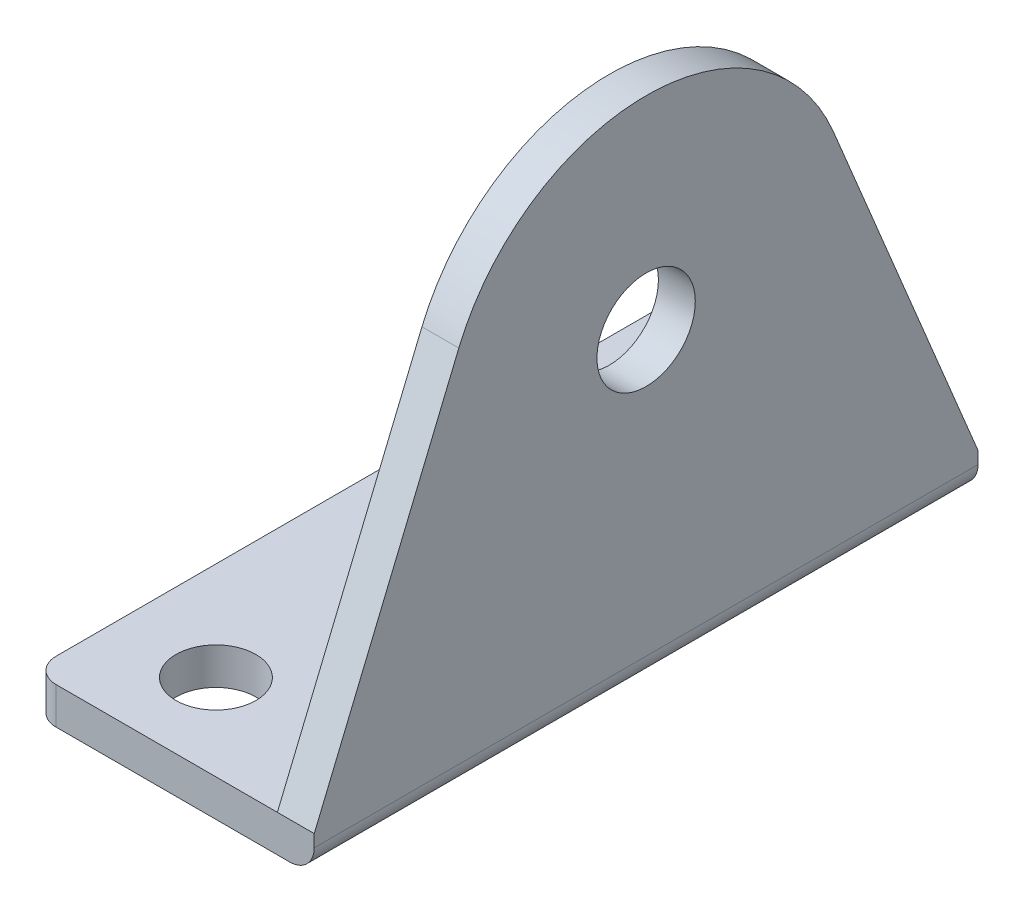
ISO-10303-21;
HEADER;
FILE_DESCRIPTION(('STEP AP214'),'2;1');
FILE_NAME('part.step','',(''),(''),'','','');
FILE_SCHEMA(('AUTOMOTIVE_DESIGN { 1 0 10303 214 1 1 1 1 }'));
ENDSEC;
DATA;
#1=APPLICATION_CONTEXT('core data for automotive mechanical design processes');
#2=APPLICATION_PROTOCOL_DEFINITION('international standard','automotive_design',2000,#1);
#3=PRODUCT_CONTEXT('',#1,'mechanical');
#4=PRODUCT('Part','Part','',(#3));
#5=PRODUCT_RELATED_PRODUCT_CATEGORY('part','',(#4));
#6=PRODUCT_DEFINITION_FORMATION('','',#4);
#7=PRODUCT_DEFINITION_CONTEXT('part definition',#1,'design');
#8=PRODUCT_DEFINITION('design','',#6,#7);
#9=PRODUCT_DEFINITION_SHAPE('','',#8);
#10=(LENGTH_UNIT() NAMED_UNIT(*) SI_UNIT(.MILLI.,.METRE.));
#11=(NAMED_UNIT(*) PLANE_ANGLE_UNIT() SI_UNIT($,.RADIAN.));
#12=(NAMED_UNIT(*) SI_UNIT($,.STERADIAN.) SOLID_ANGLE_UNIT());
#13=UNCERTAINTY_MEASURE_WITH_UNIT(LENGTH_MEASURE(1.E-05),#10,'distance_accuracy_value','');
#14=(GEOMETRIC_REPRESENTATION_CONTEXT(3) GLOBAL_UNCERTAINTY_ASSIGNED_CONTEXT((#13)) GLOBAL_UNIT_ASSIGNED_CONTEXT((#10,
#11,#12)) REPRESENTATION_CONTEXT('',''));
#15=CARTESIAN_POINT('',(0.,0.,0.));
#16=DIRECTION('',(0.,0.,1.));
#17=DIRECTION('',(1.,0.,0.));
#18=AXIS2_PLACEMENT_3D('',#15,#16,#17);
#19=CARTESIAN_POINT('',(-11.,-22.,0.));
#20=DIRECTION('',(-1.,0.,0.));
#21=DIRECTION('',(0.,0.,-1.));
#22=AXIS2_PLACEMENT_3D('',#19,#20,#21);
#23=PLANE('',#22);
#24=DIRECTION('',(0.,0.,1.));
#25=VECTOR('',#24,1.);
#26=CARTESIAN_POINT('',(-11.,-25.,25.));
#27=LINE('',#26,#25);
#28=CARTESIAN_POINT('',(-11.,-25.,-25.));
#29=VERTEX_POINT('',#28);
#30=CARTESIAN_POINT('',(-11.,-25.,25.));
#31=VERTEX_POINT('',#30);
#32=EDGE_CURVE('E140',#29,#31,#27,.T.);
#33=ORIENTED_EDGE('',*,*,#32,.T.);
#34=DIRECTION('',(0.,-1.,0.));
#35=VECTOR('',#34,1.);
#36=CARTESIAN_POINT('',(-11.,-22.,25.));
#37=LINE('',#36,#35);
#38=CARTESIAN_POINT('',(-11.,-22.,25.));
#39=VERTEX_POINT('',#38);
#40=EDGE_CURVE('E184',#39,#31,#37,.T.);
#41=ORIENTED_EDGE('',*,*,#40,.F.);
#42=DIRECTION('',(0.,0.,-1.));
#43=VECTOR('',#42,1.);
#44=CARTESIAN_POINT('',(-11.,-22.,25.));
#45=LINE('',#44,#43);
#46=CARTESIAN_POINT('',(-11.,-22.,-25.));
#47=VERTEX_POINT('',#46);
#48=EDGE_CURVE('E143',#39,#47,#45,.T.);
#49=ORIENTED_EDGE('',*,*,#48,.T.);
#50=DIRECTION('',(0.,-1.,0.));
#51=VECTOR('',#50,1.);
#52=CARTESIAN_POINT('',(-11.,-22.,-25.));
#53=LINE('',#52,#51);
#54=EDGE_CURVE('E12',#47,#29,#53,.T.);
#55=ORIENTED_EDGE('',*,*,#54,.T.);
#56=EDGE_LOOP('',(#33,#41,#49,#55));
#57=FACE_BOUND('',#56,.T.);
#58=ADVANCED_FACE('F52',(#57),#23,.T.);
#59=CARTESIAN_POINT('',(-9.,-22.,-25.));
#60=DIRECTION('',(0.,1.,0.));
#61=DIRECTION('',(0.,0.,-1.));
#62=AXIS2_PLACEMENT_3D('',#59,#60,#61);
#63=CYLINDRICAL_SURFACE('',#62,2.);
#64=CARTESIAN_POINT('',(-9.,-25.,-25.));
#65=DIRECTION('',(0.,1.,0.));
#66=DIRECTION('',(0.,0.,-1.));
#67=AXIS2_PLACEMENT_3D('',#64,#65,#66);
#68=CIRCLE('',#67,2.);
#69=CARTESIAN_POINT('',(-9.,-25.,-27.));
#70=VERTEX_POINT('',#69);
#71=EDGE_CURVE('E92',#70,#29,#68,.T.);
#72=ORIENTED_EDGE('',*,*,#71,.T.);
#73=ORIENTED_EDGE('',*,*,#54,.F.);
#74=CARTESIAN_POINT('',(-9.,-22.,-25.));
#75=DIRECTION('',(0.,-1.,0.));
#76=DIRECTION('',(0.,0.,-1.));
#77=AXIS2_PLACEMENT_3D('',#74,#75,#76);
#78=CIRCLE('',#77,2.);
#79=CARTESIAN_POINT('',(-9.,-22.,-27.));
#80=VERTEX_POINT('',#79);
#81=EDGE_CURVE('E206',#47,#80,#78,.T.);
#82=ORIENTED_EDGE('',*,*,#81,.T.);
#83=DIRECTION('',(0.,-1.,0.));
#84=VECTOR('',#83,1.);
#85=CARTESIAN_POINT('',(-9.,-22.,-27.));
#86=LINE('',#85,#84);
#87=EDGE_CURVE('E148',#80,#70,#86,.T.);
#88=ORIENTED_EDGE('',*,*,#87,.T.);
#89=EDGE_LOOP('',(#72,#73,#82,#88));
#90=FACE_BOUND('',#89,.T.);
#91=ADVANCED_FACE('F146',(#90),#63,.T.);
#92=CARTESIAN_POINT('',(12.,-22.,0.));
#93=DIRECTION('',(1.,0.,0.));
#94=DIRECTION('',(0.,0.,1.));
#95=AXIS2_PLACEMENT_3D('',#92,#93,#94);
#96=PLANE('',#95);
#97=CARTESIAN_POINT('',(12.,0.,0.));
#98=DIRECTION('',(1.,0.,0.));
#99=DIRECTION('',(0.,0.,-1.));
#100=AXIS2_PLACEMENT_3D('',#97,#98,#99);
#101=CIRCLE('',#100,4.);
#102=CARTESIAN_POINT('',(12.,0.,-4.));
#103=VERTEX_POINT('',#102);
#104=EDGE_CURVE('E316',#103,#103,#101,.T.);
#105=ORIENTED_EDGE('',*,*,#104,.F.);
#106=EDGE_LOOP('',(#105));
#107=FACE_BOUND('',#106,.T.);
#108=DIRECTION('',(0.,0.,-1.));
#109=VECTOR('',#108,1.);
#110=CARTESIAN_POINT('',(12.,-23.,0.));
#111=LINE('',#110,#109);
#112=CARTESIAN_POINT('',(12.,-23.,27.));
#113=VERTEX_POINT('',#112);
#114=CARTESIAN_POINT('',(12.,-23.,-27.));
#115=VERTEX_POINT('',#114);
#116=EDGE_CURVE('E186',#113,#115,#111,.T.);
#117=ORIENTED_EDGE('',*,*,#116,.T.);
#118=DIRECTION('',(0.,-1.,0.));
#119=VECTOR('',#118,1.);
#120=CARTESIAN_POINT('',(12.,-22.,-27.));
#121=LINE('',#120,#119);
#122=CARTESIAN_POINT('',(12.,-22.,-27.));
#123=VERTEX_POINT('',#122);
#124=EDGE_CURVE('E199',#123,#115,#121,.T.);
#125=ORIENTED_EDGE('',*,*,#124,.F.);
#126=DIRECTION('',(0.,-0.923558334060066,-0.383457955437354));
#127=VECTOR('',#126,1.);
#128=CARTESIAN_POINT('',(12.,-22.,-27.));
#129=LINE('',#128,#127);
#130=CARTESIAN_POINT('',(12.,6.32705626471634,-15.2387125119911));
#131=VERTEX_POINT('',#130);
#132=EDGE_CURVE('E118',#131,#123,#129,.T.);
#133=ORIENTED_EDGE('',*,*,#132,.F.);
#134=CARTESIAN_POINT('',(12.,0.,0.));
#135=DIRECTION('',(-1.,0.,0.));
#136=DIRECTION('',(0.,0.,-1.));
#137=AXIS2_PLACEMENT_3D('',#134,#135,#136);
#138=CIRCLE('',#137,16.5);
#139=CARTESIAN_POINT('',(12.,6.32705626471634,15.2387125119911));
#140=VERTEX_POINT('',#139);
#141=EDGE_CURVE('E165',#140,#131,#138,.T.);
#142=ORIENTED_EDGE('',*,*,#141,.F.);
#143=DIRECTION('',(0.,0.923558334060066,-0.383457955437354));
#144=VECTOR('',#143,1.);
#145=CARTESIAN_POINT('',(12.,-22.,27.));
#146=LINE('',#145,#144);
#147=CARTESIAN_POINT('',(12.,-22.,27.));
#148=VERTEX_POINT('',#147);
#149=EDGE_CURVE('E151',#148,#140,#146,.T.);
#150=ORIENTED_EDGE('',*,*,#149,.F.);
#151=DIRECTION('',(0.,-1.,0.));
#152=VECTOR('',#151,1.);
#153=CARTESIAN_POINT('',(12.,-22.,27.));
#154=LINE('',#153,#152);
#155=EDGE_CURVE('E63',#148,#113,#154,.T.);
#156=ORIENTED_EDGE('',*,*,#155,.T.);
#157=EDGE_LOOP('',(#117,#125,#133,#142,#150,#156));
#158=FACE_BOUND('',#157,.T.);
#159=ADVANCED_FACE('F485',(#107,#158),#96,.T.);
#160=CARTESIAN_POINT('',(1.5,-22.,27.));
#161=DIRECTION('',(0.,0.,1.));
#162=DIRECTION('',(-1.,0.,0.));
#163=AXIS2_PLACEMENT_3D('',#160,#161,#162);
#164=PLANE('',#163);
#165=CARTESIAN_POINT('',(10.,-23.,27.));
#166=DIRECTION('',(0.,0.,1.));
#167=DIRECTION('',(0.,-1.,0.));
#168=AXIS2_PLACEMENT_3D('',#165,#166,#167);
#169=CIRCLE('',#168,2.);
#170=CARTESIAN_POINT('',(10.,-25.,27.));
#171=VERTEX_POINT('',#170);
#172=EDGE_CURVE('E191',#171,#113,#169,.T.);
#173=ORIENTED_EDGE('',*,*,#172,.T.);
#174=ORIENTED_EDGE('',*,*,#155,.F.);
#175=DIRECTION('',(-1.,0.,0.));
#176=VECTOR('',#175,1.);
#177=CARTESIAN_POINT('',(12.,-22.,27.));
#178=LINE('',#177,#176);
#179=CARTESIAN_POINT('',(9.,-22.,27.));
#180=VERTEX_POINT('',#179);
#181=EDGE_CURVE('E170',#148,#180,#178,.T.);
#182=ORIENTED_EDGE('',*,*,#181,.T.);
#183=DIRECTION('',(-1.,0.,0.));
#184=VECTOR('',#183,1.);
#185=CARTESIAN_POINT('',(12.,-22.,27.));
#186=LINE('',#185,#184);
#187=CARTESIAN_POINT('',(-9.,-22.,27.));
#188=VERTEX_POINT('',#187);
#189=EDGE_CURVE('E210',#180,#188,#186,.T.);
#190=ORIENTED_EDGE('',*,*,#189,.T.);
#191=DIRECTION('',(0.,-1.,0.));
#192=VECTOR('',#191,1.);
#193=CARTESIAN_POINT('',(-9.,-22.,27.));
#194=LINE('',#193,#192);
#195=CARTESIAN_POINT('',(-9.,-25.,27.));
#196=VERTEX_POINT('',#195);
#197=EDGE_CURVE('E72',#188,#196,#194,.T.);
#198=ORIENTED_EDGE('',*,*,#197,.T.);
#199=DIRECTION('',(1.,0.,0.));
#200=VECTOR('',#199,1.);
#201=CARTESIAN_POINT('',(12.,-25.,27.));
#202=LINE('',#201,#200);
#203=EDGE_CURVE('E101',#196,#171,#202,.T.);
#204=ORIENTED_EDGE('',*,*,#203,.T.);
#205=EDGE_LOOP('',(#173,#174,#182,#190,#198,#204));
#206=FACE_BOUND('',#205,.T.);
#207=ADVANCED_FACE('F326',(#206),#164,.T.);
#208=CARTESIAN_POINT('',(-9.,-22.,25.));
#209=DIRECTION('',(0.,1.,0.));
#210=DIRECTION('',(0.,0.,-1.));
#211=AXIS2_PLACEMENT_3D('',#208,#209,#210);
#212=CYLINDRICAL_SURFACE('',#211,2.);
#213=CARTESIAN_POINT('',(-9.,-25.,25.));
#214=DIRECTION('',(0.,1.,0.));
#215=DIRECTION('',(0.,0.,-1.));
#216=AXIS2_PLACEMENT_3D('',#213,#214,#215);
#217=CIRCLE('',#216,2.);
#218=EDGE_CURVE('E155',#31,#196,#217,.T.);
#219=ORIENTED_EDGE('',*,*,#218,.T.);
#220=ORIENTED_EDGE('',*,*,#197,.F.);
#221=CARTESIAN_POINT('',(-9.,-22.,25.));
#222=DIRECTION('',(0.,-1.,0.));
#223=DIRECTION('',(0.,0.,-1.));
#224=AXIS2_PLACEMENT_3D('',#221,#222,#223);
#225=CIRCLE('',#224,2.);
#226=EDGE_CURVE('E205',#188,#39,#225,.T.);
#227=ORIENTED_EDGE('',*,*,#226,.T.);
#228=ORIENTED_EDGE('',*,*,#40,.T.);
#229=EDGE_LOOP('',(#219,#220,#227,#228));
#230=FACE_BOUND('',#229,.T.);
#231=ADVANCED_FACE('F464',(#230),#212,.T.);
#232=CARTESIAN_POINT('',(0.634491366874853,-22.,0.));
#233=DIRECTION('',(0.,-1.,0.));
#234=DIRECTION('',(0.,0.,-1.));
#235=AXIS2_PLACEMENT_3D('',#232,#233,#234);
#236=PLANE('',#235);
#237=DIRECTION('',(0.,0.,-1.));
#238=VECTOR('',#237,1.);
#239=CARTESIAN_POINT('',(9.,-22.,0.));
#240=LINE('',#239,#238);
#241=CARTESIAN_POINT('',(9.,-22.,-27.));
#242=VERTEX_POINT('',#241);
#243=EDGE_CURVE('E212',#180,#242,#240,.T.);
#244=ORIENTED_EDGE('',*,*,#243,.T.);
#245=DIRECTION('',(1.,0.,0.));
#246=VECTOR('',#245,1.);
#247=CARTESIAN_POINT('',(-9.,-22.,-27.));
#248=LINE('',#247,#246);
#249=EDGE_CURVE('E162',#80,#242,#248,.T.);
#250=ORIENTED_EDGE('',*,*,#249,.F.);
#251=ORIENTED_EDGE('',*,*,#81,.F.);
#252=ORIENTED_EDGE('',*,*,#48,.F.);
#253=ORIENTED_EDGE('',*,*,#226,.F.);
#254=ORIENTED_EDGE('',*,*,#189,.F.);
#255=EDGE_LOOP('',(#244,#250,#251,#252,#253,#254));
#256=FACE_BOUND('',#255,.T.);
#257=CARTESIAN_POINT('',(-3.,-22.,20.));
#258=DIRECTION('',(0.,-1.,0.));
#259=DIRECTION('',(1.,0.,0.));
#260=AXIS2_PLACEMENT_3D('',#257,#258,#259);
#261=CIRCLE('',#260,3.25);
#262=CARTESIAN_POINT('',(0.25,-22.,20.));
#263=VERTEX_POINT('',#262);
#264=EDGE_CURVE('E224',#263,#263,#261,.T.);
#265=ORIENTED_EDGE('',*,*,#264,.T.);
#266=EDGE_LOOP('',(#265));
#267=FACE_BOUND('',#266,.T.);
#268=CARTESIAN_POINT('',(-3.,-22.,-20.));
#269=DIRECTION('',(0.,-1.,0.));
#270=DIRECTION('',(1.,0.,0.));
#271=AXIS2_PLACEMENT_3D('',#268,#269,#270);
#272=CIRCLE('',#271,3.25);
#273=CARTESIAN_POINT('',(0.25,-22.,-20.));
#274=VERTEX_POINT('',#273);
#275=EDGE_CURVE('E239',#274,#274,#272,.T.);
#276=ORIENTED_EDGE('',*,*,#275,.T.);
#277=EDGE_LOOP('',(#276));
#278=FACE_BOUND('',#277,.T.);
#279=ADVANCED_FACE('F451',(#256,#267,#278),#236,.F.);
#280=CARTESIAN_POINT('',(9.,-7.72618153802992,0.));
#281=DIRECTION('',(1.,0.,0.));
#282=DIRECTION('',(0.,0.,-1.));
#283=AXIS2_PLACEMENT_3D('',#280,#281,#282);
#284=PLANE('',#283);
#285=CARTESIAN_POINT('',(9.,0.,0.));
#286=DIRECTION('',(1.,0.,0.));
#287=DIRECTION('',(0.,0.,-1.));
#288=AXIS2_PLACEMENT_3D('',#285,#286,#287);
#289=CIRCLE('',#288,4.);
#290=CARTESIAN_POINT('',(9.,0.,-4.));
#291=VERTEX_POINT('',#290);
#292=EDGE_CURVE('E56',#291,#291,#289,.T.);
#293=ORIENTED_EDGE('',*,*,#292,.T.);
#294=EDGE_LOOP('',(#293));
#295=FACE_BOUND('',#294,.T.);
#296=ORIENTED_EDGE('',*,*,#243,.F.);
#297=DIRECTION('',(0.,0.923558334060066,-0.383457955437354));
#298=VECTOR('',#297,1.);
#299=CARTESIAN_POINT('',(9.,-22.,27.));
#300=LINE('',#299,#298);
#301=CARTESIAN_POINT('',(9.,6.32705626471634,15.2387125119911));
#302=VERTEX_POINT('',#301);
#303=EDGE_CURVE('E251',#180,#302,#300,.T.);
#304=ORIENTED_EDGE('',*,*,#303,.T.);
#305=CARTESIAN_POINT('',(9.,0.,0.));
#306=DIRECTION('',(1.,0.,0.));
#307=DIRECTION('',(0.,0.,-1.));
#308=AXIS2_PLACEMENT_3D('',#305,#306,#307);
#309=CIRCLE('',#308,16.5);
#310=CARTESIAN_POINT('',(9.,6.32705626471634,-15.2387125119911));
#311=VERTEX_POINT('',#310);
#312=EDGE_CURVE('E260',#311,#302,#309,.T.);
#313=ORIENTED_EDGE('',*,*,#312,.F.);
#314=DIRECTION('',(0.,0.923558334060066,0.383457955437354));
#315=VECTOR('',#314,1.);
#316=CARTESIAN_POINT('',(9.,-22.,-27.));
#317=LINE('',#316,#315);
#318=EDGE_CURVE('E217',#242,#311,#317,.T.);
#319=ORIENTED_EDGE('',*,*,#318,.F.);
#320=EDGE_LOOP('',(#296,#304,#313,#319));
#321=FACE_BOUND('',#320,.T.);
#322=ADVANCED_FACE('F338',(#295,#321),#284,.F.);
#323=CARTESIAN_POINT('',(9.,-7.83647186764183,-21.1193562559956));
#324=DIRECTION('',(0.,0.383457955437354,-0.923558334060066));
#325=DIRECTION('',(0.,0.923558334060066,0.383457955437354));
#326=AXIS2_PLACEMENT_3D('',#323,#324,#325);
#327=PLANE('',#326);
#328=ORIENTED_EDGE('',*,*,#132,.T.);
#329=DIRECTION('',(1.,0.,0.));
#330=VECTOR('',#329,1.);
#331=CARTESIAN_POINT('',(-9.,-22.,-27.));
#332=LINE('',#331,#330);
#333=EDGE_CURVE('E202',#242,#123,#332,.T.);
#334=ORIENTED_EDGE('',*,*,#333,.F.);
#335=ORIENTED_EDGE('',*,*,#318,.T.);
#336=DIRECTION('',(1.,0.,0.));
#337=VECTOR('',#336,1.);
#338=CARTESIAN_POINT('',(9.,6.32705626471634,-15.2387125119911));
#339=LINE('',#338,#337);
#340=EDGE_CURVE('E169',#311,#131,#339,.T.);
#341=ORIENTED_EDGE('',*,*,#340,.T.);
#342=EDGE_LOOP('',(#328,#334,#335,#341));
#343=FACE_BOUND('',#342,.T.);
#344=ADVANCED_FACE('F344',(#343),#327,.T.);
#345=CARTESIAN_POINT('',(9.,0.,0.));
#346=DIRECTION('',(-1.,0.,0.));
#347=DIRECTION('',(0.,0.,-1.));
#348=AXIS2_PLACEMENT_3D('',#345,#346,#347);
#349=CYLINDRICAL_SURFACE('',#348,16.5);
#350=ORIENTED_EDGE('',*,*,#141,.T.);
#351=ORIENTED_EDGE('',*,*,#340,.F.);
#352=ORIENTED_EDGE('',*,*,#312,.T.);
#353=DIRECTION('',(1.,0.,0.));
#354=VECTOR('',#353,1.);
#355=CARTESIAN_POINT('',(9.,6.32705626471634,15.2387125119911));
#356=LINE('',#355,#354);
#357=EDGE_CURVE('E219',#302,#140,#356,.T.);
#358=ORIENTED_EDGE('',*,*,#357,.T.);
#359=EDGE_LOOP('',(#350,#351,#352,#358));
#360=FACE_BOUND('',#359,.T.);
#361=ADVANCED_FACE('F342',(#360),#349,.T.);
#362=CARTESIAN_POINT('',(9.,-7.83647186764183,21.1193562559956));
#363=DIRECTION('',(0.,0.383457955437354,0.923558334060066));
#364=DIRECTION('',(0.,-0.923558334060066,0.383457955437354));
#365=AXIS2_PLACEMENT_3D('',#362,#363,#364);
#366=PLANE('',#365);
#367=ORIENTED_EDGE('',*,*,#149,.T.);
#368=ORIENTED_EDGE('',*,*,#357,.F.);
#369=ORIENTED_EDGE('',*,*,#303,.F.);
#370=ORIENTED_EDGE('',*,*,#181,.F.);
#371=EDGE_LOOP('',(#367,#368,#369,#370));
#372=FACE_BOUND('',#371,.T.);
#373=ADVANCED_FACE('F333',(#372),#366,.T.);
#374=CARTESIAN_POINT('',(0.634491366874853,-25.,0.));
#375=DIRECTION('',(0.,-1.,0.));
#376=DIRECTION('',(0.,0.,-1.));
#377=AXIS2_PLACEMENT_3D('',#374,#375,#376);
#378=PLANE('',#377);
#379=DIRECTION('',(0.,0.,-1.));
#380=VECTOR('',#379,1.);
#381=CARTESIAN_POINT('',(10.,-25.,0.));
#382=LINE('',#381,#380);
#383=CARTESIAN_POINT('',(10.,-25.,-27.));
#384=VERTEX_POINT('',#383);
#385=EDGE_CURVE('E255',#171,#384,#382,.T.);
#386=ORIENTED_EDGE('',*,*,#385,.F.);
#387=ORIENTED_EDGE('',*,*,#203,.F.);
#388=ORIENTED_EDGE('',*,*,#218,.F.);
#389=ORIENTED_EDGE('',*,*,#32,.F.);
#390=ORIENTED_EDGE('',*,*,#71,.F.);
#391=DIRECTION('',(-1.,0.,0.));
#392=VECTOR('',#391,1.);
#393=CARTESIAN_POINT('',(-9.,-25.,-27.));
#394=LINE('',#393,#392);
#395=EDGE_CURVE('E245',#384,#70,#394,.T.);
#396=ORIENTED_EDGE('',*,*,#395,.F.);
#397=EDGE_LOOP('',(#386,#387,#388,#389,#390,#396));
#398=FACE_BOUND('',#397,.T.);
#399=CARTESIAN_POINT('',(-3.,-25.,20.));
#400=DIRECTION('',(0.,1.,0.));
#401=DIRECTION('',(1.,0.,0.));
#402=AXIS2_PLACEMENT_3D('',#399,#400,#401);
#403=CIRCLE('',#402,3.25);
#404=CARTESIAN_POINT('',(0.25,-25.,20.));
#405=VERTEX_POINT('',#404);
#406=EDGE_CURVE('E221',#405,#405,#403,.T.);
#407=ORIENTED_EDGE('',*,*,#406,.T.);
#408=EDGE_LOOP('',(#407));
#409=FACE_BOUND('',#408,.T.);
#410=CARTESIAN_POINT('',(-3.,-25.,-20.));
#411=DIRECTION('',(0.,1.,0.));
#412=DIRECTION('',(1.,0.,0.));
#413=AXIS2_PLACEMENT_3D('',#410,#411,#412);
#414=CIRCLE('',#413,3.25);
#415=CARTESIAN_POINT('',(0.25,-25.,-20.));
#416=VERTEX_POINT('',#415);
#417=EDGE_CURVE('E232',#416,#416,#414,.T.);
#418=ORIENTED_EDGE('',*,*,#417,.T.);
#419=EDGE_LOOP('',(#418));
#420=FACE_BOUND('',#419,.T.);
#421=ADVANCED_FACE('F153',(#398,#409,#420),#378,.T.);
#422=CARTESIAN_POINT('',(1.5,-22.,-27.));
#423=DIRECTION('',(0.,0.,-1.));
#424=DIRECTION('',(1.,0.,0.));
#425=AXIS2_PLACEMENT_3D('',#422,#423,#424);
#426=PLANE('',#425);
#427=CARTESIAN_POINT('',(10.,-23.,-27.));
#428=DIRECTION('',(0.,0.,-1.));
#429=DIRECTION('',(0.,-1.,0.));
#430=AXIS2_PLACEMENT_3D('',#427,#428,#429);
#431=CIRCLE('',#430,2.);
#432=EDGE_CURVE('E192',#115,#384,#431,.T.);
#433=ORIENTED_EDGE('',*,*,#432,.T.);
#434=ORIENTED_EDGE('',*,*,#395,.T.);
#435=ORIENTED_EDGE('',*,*,#87,.F.);
#436=ORIENTED_EDGE('',*,*,#249,.T.);
#437=ORIENTED_EDGE('',*,*,#333,.T.);
#438=ORIENTED_EDGE('',*,*,#124,.T.);
#439=EDGE_LOOP('',(#433,#434,#435,#436,#437,#438));
#440=FACE_BOUND('',#439,.T.);
#441=ADVANCED_FACE('F272',(#440),#426,.T.);
#442=CARTESIAN_POINT('',(10.,-23.,-28.));
#443=DIRECTION('',(0.,0.,-1.));
#444=DIRECTION('',(0.,-1.,0.));
#445=AXIS2_PLACEMENT_3D('',#442,#443,#444);
#446=CYLINDRICAL_SURFACE('',#445,2.);
#447=ORIENTED_EDGE('',*,*,#432,.F.);
#448=ORIENTED_EDGE('',*,*,#116,.F.);
#449=ORIENTED_EDGE('',*,*,#172,.F.);
#450=ORIENTED_EDGE('',*,*,#385,.T.);
#451=EDGE_LOOP('',(#447,#448,#449,#450));
#452=FACE_BOUND('',#451,.T.);
#453=ADVANCED_FACE('F277',(#452),#446,.T.);
#454=CARTESIAN_POINT('',(-3.,-23.5,20.));
#455=DIRECTION('',(0.,1.,0.));
#456=DIRECTION('',(1.,0.,0.));
#457=AXIS2_PLACEMENT_3D('',#454,#455,#456);
#458=CYLINDRICAL_SURFACE('',#457,3.25);
#459=ORIENTED_EDGE('',*,*,#406,.F.);
#460=EDGE_LOOP('',(#459));
#461=FACE_BOUND('',#460,.T.);
#462=ORIENTED_EDGE('',*,*,#264,.F.);
#463=EDGE_LOOP('',(#462));
#464=FACE_BOUND('',#463,.T.);
#465=ADVANCED_FACE('F372',(#461,#464),#458,.F.);
#466=CARTESIAN_POINT('',(-3.,-23.5,-20.));
#467=DIRECTION('',(0.,1.,0.));
#468=DIRECTION('',(1.,0.,0.));
#469=AXIS2_PLACEMENT_3D('',#466,#467,#468);
#470=CYLINDRICAL_SURFACE('',#469,3.25);
#471=ORIENTED_EDGE('',*,*,#417,.F.);
#472=EDGE_LOOP('',(#471));
#473=FACE_BOUND('',#472,.T.);
#474=ORIENTED_EDGE('',*,*,#275,.F.);
#475=EDGE_LOOP('',(#474));
#476=FACE_BOUND('',#475,.T.);
#477=ADVANCED_FACE('F54',(#473,#476),#470,.F.);
#478=CARTESIAN_POINT('',(-11.,0.,0.));
#479=DIRECTION('',(1.,0.,0.));
#480=DIRECTION('',(0.,0.,-1.));
#481=AXIS2_PLACEMENT_3D('',#478,#479,#480);
#482=CYLINDRICAL_SURFACE('',#481,4.);
#483=ORIENTED_EDGE('',*,*,#104,.T.);
#484=EDGE_LOOP('',(#483));
#485=FACE_BOUND('',#484,.T.);
#486=ORIENTED_EDGE('',*,*,#292,.F.);
#487=EDGE_LOOP('',(#486));
#488=FACE_BOUND('',#487,.T.);
#489=ADVANCED_FACE('F371',(#485,#488),#482,.F.);
#490=CLOSED_SHELL('',(#58,#91,#159,#207,#231,#279,#322,#344,#361,#373,#421,#441,#453,#465,#477,#489));
#491=MANIFOLD_SOLID_BREP('B2',#490);
#492=ADVANCED_BREP_SHAPE_REPRESENTATION('',(#18,#491),#14);
#493=SHAPE_DEFINITION_REPRESENTATION(#9,#492);
ENDSEC;
END-ISO-10303-21;
